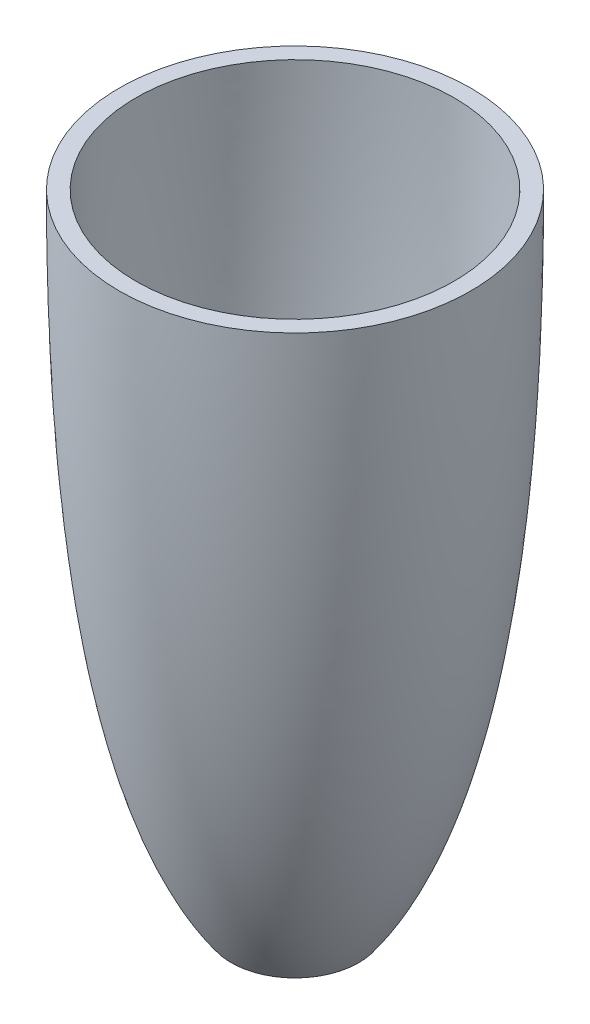
ISO-10303-21;
HEADER;
FILE_DESCRIPTION(('STEP AP214'),'2;1');
FILE_NAME('part.step','',(''),(''),'','','');
FILE_SCHEMA(('AUTOMOTIVE_DESIGN { 1 0 10303 214 1 1 1 1 }'));
ENDSEC;
DATA;
#1=APPLICATION_CONTEXT('core data for automotive mechanical design processes');
#2=APPLICATION_PROTOCOL_DEFINITION('international standard','automotive_design',2000,#1);
#3=PRODUCT_CONTEXT('',#1,'mechanical');
#4=PRODUCT('Part','Part','',(#3));
#5=PRODUCT_RELATED_PRODUCT_CATEGORY('part','',(#4));
#6=PRODUCT_DEFINITION_FORMATION('','',#4);
#7=PRODUCT_DEFINITION_CONTEXT('part definition',#1,'design');
#8=PRODUCT_DEFINITION('design','',#6,#7);
#9=PRODUCT_DEFINITION_SHAPE('','',#8);
#10=(LENGTH_UNIT() NAMED_UNIT(*) SI_UNIT(.MILLI.,.METRE.));
#11=(NAMED_UNIT(*) PLANE_ANGLE_UNIT() SI_UNIT($,.RADIAN.));
#12=(NAMED_UNIT(*) SI_UNIT($,.STERADIAN.) SOLID_ANGLE_UNIT());
#13=UNCERTAINTY_MEASURE_WITH_UNIT(LENGTH_MEASURE(1.E-05),#10,'distance_accuracy_value','');
#14=(GEOMETRIC_REPRESENTATION_CONTEXT(3) GLOBAL_UNCERTAINTY_ASSIGNED_CONTEXT((#13)) GLOBAL_UNIT_ASSIGNED_CONTEXT((#10,
#11,#12)) REPRESENTATION_CONTEXT('',''));
#15=CARTESIAN_POINT('',(0.,0.,0.));
#16=DIRECTION('',(0.,0.,1.));
#17=DIRECTION('',(1.,0.,0.));
#18=AXIS2_PLACEMENT_3D('',#15,#16,#17);
#19=CARTESIAN_POINT('',(3.81134684843429,-0.584565044743311,0.));
#20=CARTESIAN_POINT('',(4.06027755336314,-0.239061760312004,0.));
#21=CARTESIAN_POINT('',(4.29627565461007,0.117901648595266,0.));
#22=CARTESIAN_POINT('',(4.73916691956127,0.84038291576123,0.));
#23=CARTESIAN_POINT('',(4.94724657156076,1.20741290610138,0.));
#24=CARTESIAN_POINT('',(5.53726983925364,2.32128855058089,0.));
#25=CARTESIAN_POINT('',(5.88515782823599,3.08040331578052,0.));
#26=CARTESIAN_POINT('',(6.82803019933795,5.3849557430264,0.));
#27=CARTESIAN_POINT('',(7.3242950629891,6.95628265212381,0.));
#28=CARTESIAN_POINT('',(8.16037662952781,10.1219630442256,0.));
#29=CARTESIAN_POINT('',(8.49866452867755,11.7176177501052,0.));
#30=CARTESIAN_POINT('',(9.06995212222526,14.9187797138893,0.));
#31=CARTESIAN_POINT('',(9.30235281965774,16.5246144471483,0.));
#32=CARTESIAN_POINT('',(9.88552292492327,21.3482960383944,0.));
#33=CARTESIAN_POINT('',(10.1245427864284,24.5718796566895,0.));
#34=CARTESIAN_POINT('',(10.3508152642182,29.4061689688867,0.));
#35=CARTESIAN_POINT('',(10.4033737988362,31.0175925452521,0.));
#36=CARTESIAN_POINT('',(10.4543939834441,33.4341693623253,0.));
#37=CARTESIAN_POINT('',(10.4667386962485,34.2396061856409,0.));
#38=CARTESIAN_POINT('',(10.4789050404383,35.4475820347035,0.));
#39=CARTESIAN_POINT('',(10.4819000749582,35.8502123440012,0.));
#40=CARTESIAN_POINT('',(10.4858636348509,36.6554062476816,0.));
#41=CARTESIAN_POINT('',(10.4867609969543,37.0593954199998,0.));
#42=CARTESIAN_POINT('',(10.4868329838804,37.4603194474662,0.));
#43=B_SPLINE_CURVE_WITH_KNOTS('',3,(#19,#20,#21,#22,#23,#24,#25,#26,#27,#28,#29,#30,#31,#32,#33,
#34,#35,#36,#37,#38,#39,#40,#41,#42),.UNSPECIFIED.,.F.,.F.,(4,2,2,2,2,2,2,2,2,2,2,4),(0.,
0.03125,0.0624999999999999,0.125,0.25,0.375,0.5,0.75,0.875,0.9375,0.96875,1.),.UNSPECIFIED.);
#44=CARTESIAN_POINT('',(0.,0.,0.));
#45=DIRECTION('',(0.,-1.,0.));
#46=AXIS1_PLACEMENT('',#44,#45);
#47=SURFACE_OF_REVOLUTION('',#43,#46);
#48=CARTESIAN_POINT('',(0.,37.4603194474662,0.));
#49=DIRECTION('',(0.,-1.,0.));
#50=DIRECTION('',(0.,0.,-1.));
#51=AXIS2_PLACEMENT_3D('',#48,#49,#50);
#52=CIRCLE('',#51,10.4868329838804);
#53=CARTESIAN_POINT('',(0.,37.4603194474662,-10.4868329838804));
#54=VERTEX_POINT('',#53);
#55=EDGE_CURVE('E52',#54,#54,#52,.T.);
#56=ORIENTED_EDGE('',*,*,#55,.T.);
#57=EDGE_LOOP('',(#56));
#58=FACE_BOUND('',#57,.T.);
#59=CARTESIAN_POINT('',(0.,-0.584565044743311,0.));
#60=DIRECTION('',(0.,-1.,0.));
#61=DIRECTION('',(0.,0.,-1.));
#62=AXIS2_PLACEMENT_3D('',#59,#60,#61);
#63=CIRCLE('',#62,3.81134684843429);
#64=CARTESIAN_POINT('',(0.,-0.584565044743311,-3.81134684843429));
#65=VERTEX_POINT('',#64);
#66=EDGE_CURVE('E10',#65,#65,#63,.T.);
#67=ORIENTED_EDGE('',*,*,#66,.F.);
#68=EDGE_LOOP('',(#67));
#69=FACE_BOUND('',#68,.T.);
#70=ADVANCED_FACE('F37',(#58,#69),#47,.F.);
#71=CARTESIAN_POINT('',(0.,-0.584565044743311,0.));
#72=DIRECTION('',(0.,-1.,0.));
#73=DIRECTION('',(0.,0.,-1.));
#74=AXIS2_PLACEMENT_3D('',#71,#72,#73);
#75=CONICAL_SURFACE('',#74,3.81134684843429,0.946452463030975);
#76=CARTESIAN_POINT('',(0.,0.,0.));
#77=DIRECTION('',(0.,-1.,0.));
#78=DIRECTION('',(0.,0.,-1.));
#79=AXIS2_PLACEMENT_3D('',#76,#77,#78);
#80=CIRCLE('',#79,3.);
#81=CARTESIAN_POINT('',(0.,0.,-3.));
#82=VERTEX_POINT('',#81);
#83=EDGE_CURVE('E44',#82,#82,#80,.T.);
#84=ORIENTED_EDGE('',*,*,#83,.F.);
#85=EDGE_LOOP('',(#84));
#86=FACE_BOUND('',#85,.T.);
#87=ORIENTED_EDGE('',*,*,#66,.T.);
#88=EDGE_LOOP('',(#87));
#89=FACE_BOUND('',#88,.T.);
#90=ADVANCED_FACE('F71',(#86,#89),#75,.F.);
#91=CARTESIAN_POINT('',(3.,0.,0.));
#92=CARTESIAN_POINT('',(3.0254679860632,0.0353482823069251,0.));
#93=CARTESIAN_POINT('',(3.07660977516217,0.106941761295579,0.));
#94=CARTESIAN_POINT('',(3.14375610698447,0.202755644357314,0.));
#95=CARTESIAN_POINT('',(3.29301767380782,0.418963615949592,0.));
#96=CARTESIAN_POINT('',(3.45265521258292,0.66096608771853,0.));
#97=CARTESIAN_POINT('',(3.66479448301973,0.999295644835665,0.));
#98=CARTESIAN_POINT('',(3.81976860820879,1.25668409174902,0.));
#99=CARTESIAN_POINT('',(4.05632879706957,1.66658951916469,0.));
#100=CARTESIAN_POINT('',(4.29256086209008,2.10176301574124,0.));
#101=CARTESIAN_POINT('',(4.52345651166175,2.55765513401188,0.));
#102=CARTESIAN_POINT('',(4.66365116342208,2.84697380325545,0.));
#103=CARTESIAN_POINT('',(4.80819639016285,3.15322181448457,0.));
#104=CARTESIAN_POINT('',(4.93150436805362,3.42449417670454,0.));
#105=CARTESIAN_POINT('',(5.13139324801181,3.88122696031495,0.));
#106=CARTESIAN_POINT('',(5.35274573735999,4.41297428902809,0.));
#107=CARTESIAN_POINT('',(5.62927155574018,5.12961450043672,0.));
#108=CARTESIAN_POINT('',(5.86567014862379,5.78894718905482,0.));
#109=CARTESIAN_POINT('',(6.05879103063416,6.36181783295967,0.));
#110=CARTESIAN_POINT('',(6.21621104192057,6.85129489726351,0.));
#111=CARTESIAN_POINT('',(6.38578246231497,7.40209454360407,0.));
#112=CARTESIAN_POINT('',(6.55859936014321,7.99528294928132,0.));
#113=CARTESIAN_POINT('',(6.73442356411922,8.63479062261759,0.));
#114=CARTESIAN_POINT('',(6.94186898724718,9.43003217464005,0.));
#115=CARTESIAN_POINT('',(7.106878859723,10.1143957331908,0.));
#116=CARTESIAN_POINT('',(7.28446314194608,10.8957696490777,0.));
#117=CARTESIAN_POINT('',(7.38410038119054,11.3560914475628,0.));
#118=CARTESIAN_POINT('',(7.49253415445634,11.8807829688362,0.));
#119=CARTESIAN_POINT('',(7.62186718958124,12.52406206666,0.));
#120=CARTESIAN_POINT('',(7.78887020070194,13.4154467382267,0.));
#121=CARTESIAN_POINT('',(7.97972277691734,14.5307242453507,0.));
#122=CARTESIAN_POINT('',(8.1602724350043,15.6786024840719,0.));
#123=CARTESIAN_POINT('',(8.31380882794641,16.7584843602103,0.));
#124=CARTESIAN_POINT('',(8.46422225488237,17.9124476730127,0.));
#125=CARTESIAN_POINT('',(8.60494271430169,19.0912344630768,0.));
#126=CARTESIAN_POINT('',(8.761578100015,20.5678715057788,0.));
#127=CARTESIAN_POINT('',(8.91628168272096,22.2410469995854,0.));
#128=CARTESIAN_POINT('',(9.03775947471805,23.7935000292281,0.));
#129=CARTESIAN_POINT('',(9.13763339056871,25.2727542512888,0.));
#130=CARTESIAN_POINT('',(9.22397411441512,26.7366751305251,0.));
#131=CARTESIAN_POINT('',(9.29742662759849,28.2494320951724,0.));
#132=CARTESIAN_POINT('',(9.35708785373015,29.7550888418155,0.));
#133=CARTESIAN_POINT('',(9.4019708133544,31.140195702223,0.));
#134=CARTESIAN_POINT('',(9.44191874276439,32.7447969421965,0.));
#135=CARTESIAN_POINT('',(9.47049676541804,34.4544652631181,0.));
#136=CARTESIAN_POINT('',(9.48264850395647,35.862387951794,0.));
#137=CARTESIAN_POINT('',(9.48594248090773,36.7440103792107,0.));
#138=CARTESIAN_POINT('',(9.4866048044453,37.0992608368134,0.));
#139=CARTESIAN_POINT('',(9.48680509866752,37.3051053029887,0.));
#140=CARTESIAN_POINT('',(9.48682368218035,37.4086043299398,0.));
#141=CARTESIAN_POINT('',(9.486833,37.460499,0.));
#142=B_SPLINE_CURVE_WITH_KNOTS('',3,(#91,#92,#93,#94,#95,#96,#97,#98,#99,#100,#101,#102,#103,
#104,#105,#106,#107,#108,#109,#110,#111,#112,#113,#114,#115,#116,#117,#118,#119,#120,#121,#122,
#123,#124,#125,#126,#127,#128,#129,#130,#131,#132,#133,#134,#135,#136,#137,#138,#139,#140,#141),
.UNSPECIFIED.,.F.,.F.,(4,1,1,1,1,1,1,1,1,1,1,1,1,1,1,1,1,1,1,1,1,1,1,1,1,1,1,1,1,1,1,1,1,1,1,1,
1,1,1,1,1,1,1,1,1,1,1,1,4),(0.,0.00339585932971592,0.00685781337383072,0.00911943820687127,
0.0238739459787789,0.0294515435296441,0.0402451796595769,0.0472903444140056,0.0663394996523502,
0.0788338167922767,0.0871201940793378,0.0913979108242986,0.105229408507463,0.11034511206428,
0.130257734050306,0.15011986618814,0.170213060663463,0.184849201224609,0.197239776715767,
0.210289086150223,0.229768878192511,0.245396191706323,0.261983976601602,0.293826818159103,
0.300263808346258,0.324441094393805,0.330536334331406,0.34202499328502,0.375584492992008,
0.401221023159978,0.430217004841614,0.466153641691834,0.486236280075734,0.520922714217306,
0.558684483862987,0.601975913991756,0.651891461668269,0.680057097085356,0.717537993210173,
0.76619370286255,0.79810590908766,0.834987729112304,0.874211677580461,0.923214336164423,
0.968265053772436,0.983955458779846,0.991932774364614,0.995955072960754,1.),.UNSPECIFIED.);
#143=CARTESIAN_POINT('',(0.,0.,0.));
#144=DIRECTION('',(0.,-1.,0.));
#145=AXIS1_PLACEMENT('',#143,#144);
#146=SURFACE_OF_REVOLUTION('',#142,#145);
#147=CARTESIAN_POINT('',(0.,37.460499,0.));
#148=DIRECTION('',(0.,-1.,0.));
#149=DIRECTION('',(0.,0.,-1.));
#150=AXIS2_PLACEMENT_3D('',#147,#148,#149);
#151=CIRCLE('',#150,9.486833);
#152=CARTESIAN_POINT('',(0.,37.460499,-9.486833));
#153=VERTEX_POINT('',#152);
#154=EDGE_CURVE('E48',#153,#153,#151,.T.);
#155=ORIENTED_EDGE('',*,*,#154,.F.);
#156=EDGE_LOOP('',(#155));
#157=FACE_BOUND('',#156,.T.);
#158=ORIENTED_EDGE('',*,*,#83,.T.);
#159=EDGE_LOOP('',(#158));
#160=FACE_BOUND('',#159,.T.);
#161=ADVANCED_FACE('F67',(#157,#160),#146,.T.);
#162=CARTESIAN_POINT('',(0.,37.460499,0.));
#163=DIRECTION('',(0.,-1.,0.));
#164=DIRECTION('',(0.,0.,-1.));
#165=AXIS2_PLACEMENT_3D('',#162,#163,#164);
#166=CONICAL_SURFACE('',#165,9.486833,1.57061677426015);
#167=ORIENTED_EDGE('',*,*,#55,.F.);
#168=EDGE_LOOP('',(#167));
#169=FACE_BOUND('',#168,.T.);
#170=ORIENTED_EDGE('',*,*,#154,.T.);
#171=EDGE_LOOP('',(#170));
#172=FACE_BOUND('',#171,.T.);
#173=ADVANCED_FACE('F70',(#169,#172),#166,.T.);
#174=CLOSED_SHELL('',(#70,#90,#161,#173));
#175=MANIFOLD_SOLID_BREP('B2',#174);
#176=ADVANCED_BREP_SHAPE_REPRESENTATION('',(#18,#175),#14);
#177=SHAPE_DEFINITION_REPRESENTATION(#9,#176);
ENDSEC;
END-ISO-10303-21;
